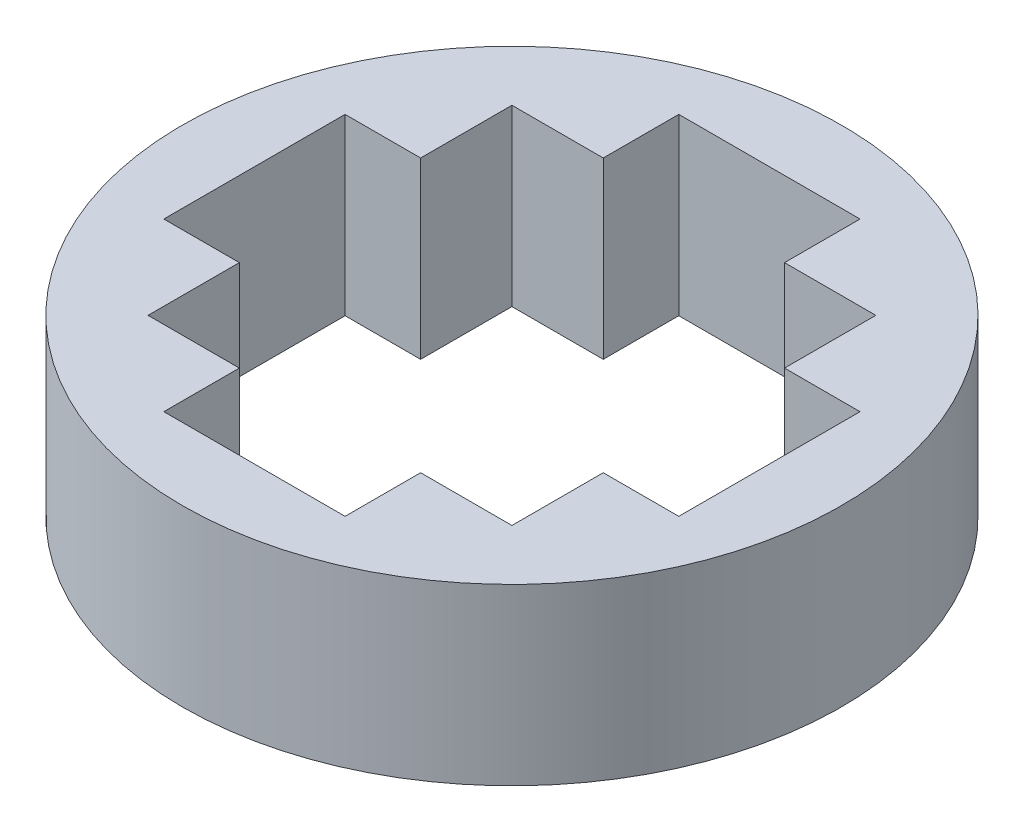
ISO-10303-21;
HEADER;
FILE_DESCRIPTION(('STEP AP214'),'2;1');
FILE_NAME('part.step','',(''),(''),'','','');
FILE_SCHEMA(('AUTOMOTIVE_DESIGN { 1 0 10303 214 1 1 1 1 }'));
ENDSEC;
DATA;
#1=APPLICATION_CONTEXT('core data for automotive mechanical design processes');
#2=APPLICATION_PROTOCOL_DEFINITION('international standard','automotive_design',2000,#1);
#3=PRODUCT_CONTEXT('',#1,'mechanical');
#4=PRODUCT('Part','Part','',(#3));
#5=PRODUCT_RELATED_PRODUCT_CATEGORY('part','',(#4));
#6=PRODUCT_DEFINITION_FORMATION('','',#4);
#7=PRODUCT_DEFINITION_CONTEXT('part definition',#1,'design');
#8=PRODUCT_DEFINITION('design','',#6,#7);
#9=PRODUCT_DEFINITION_SHAPE('','',#8);
#10=(LENGTH_UNIT() NAMED_UNIT(*) SI_UNIT(.MILLI.,.METRE.));
#11=(NAMED_UNIT(*) PLANE_ANGLE_UNIT() SI_UNIT($,.RADIAN.));
#12=(NAMED_UNIT(*) SI_UNIT($,.STERADIAN.) SOLID_ANGLE_UNIT());
#13=UNCERTAINTY_MEASURE_WITH_UNIT(LENGTH_MEASURE(1.E-05),#10,'distance_accuracy_value','');
#14=(GEOMETRIC_REPRESENTATION_CONTEXT(3) GLOBAL_UNCERTAINTY_ASSIGNED_CONTEXT((#13)) GLOBAL_UNIT_ASSIGNED_CONTEXT((#10,
#11,#12)) REPRESENTATION_CONTEXT('',''));
#15=CARTESIAN_POINT('',(0.,0.,0.));
#16=DIRECTION('',(0.,0.,1.));
#17=DIRECTION('',(1.,0.,0.));
#18=AXIS2_PLACEMENT_3D('',#15,#16,#17);
#19=CARTESIAN_POINT('',(0.,6.35,0.));
#20=DIRECTION('',(0.,1.,0.));
#21=DIRECTION('',(0.,0.,1.));
#22=AXIS2_PLACEMENT_3D('',#19,#20,#21);
#23=PLANE('',#22);
#24=CARTESIAN_POINT('',(0.,6.35,0.));
#25=DIRECTION('',(0.,1.,0.));
#26=DIRECTION('',(0.,0.,1.));
#27=AXIS2_PLACEMENT_3D('',#24,#25,#26);
#28=CIRCLE('',#27,24.);
#29=CARTESIAN_POINT('',(0.,6.35,24.));
#30=VERTEX_POINT('',#29);
#31=EDGE_CURVE('E11',#30,#30,#28,.T.);
#32=ORIENTED_EDGE('',*,*,#31,.T.);
#33=EDGE_LOOP('',(#32));
#34=FACE_BOUND('',#33,.T.);
#35=DIRECTION('',(-1.,0.,0.));
#36=VECTOR('',#35,1.);
#37=CARTESIAN_POINT('',(-13.25,6.35,-13.25));
#38=LINE('',#37,#36);
#39=CARTESIAN_POINT('',(-6.6,6.35,-13.25));
#40=VERTEX_POINT('',#39);
#41=CARTESIAN_POINT('',(-13.25,6.35,-13.25));
#42=VERTEX_POINT('',#41);
#43=EDGE_CURVE('E178',#40,#42,#38,.T.);
#44=ORIENTED_EDGE('',*,*,#43,.F.);
#45=DIRECTION('',(0.,0.,1.));
#46=VECTOR('',#45,1.);
#47=CARTESIAN_POINT('',(-6.6,6.35,-13.25));
#48=LINE('',#47,#46);
#49=CARTESIAN_POINT('',(-6.6,6.35,-18.75));
#50=VERTEX_POINT('',#49);
#51=EDGE_CURVE('E170',#50,#40,#48,.T.);
#52=ORIENTED_EDGE('',*,*,#51,.F.);
#53=DIRECTION('',(-1.,0.,0.));
#54=VECTOR('',#53,1.);
#55=CARTESIAN_POINT('',(-6.6,6.35,-18.75));
#56=LINE('',#55,#54);
#57=CARTESIAN_POINT('',(6.6,6.35,-18.75));
#58=VERTEX_POINT('',#57);
#59=EDGE_CURVE('E226',#58,#50,#56,.T.);
#60=ORIENTED_EDGE('',*,*,#59,.F.);
#61=DIRECTION('',(0.,0.,-1.));
#62=VECTOR('',#61,1.);
#63=CARTESIAN_POINT('',(6.6,6.35,-18.75));
#64=LINE('',#63,#62);
#65=CARTESIAN_POINT('',(6.6,6.35,-13.25));
#66=VERTEX_POINT('',#65);
#67=EDGE_CURVE('E224',#66,#58,#64,.T.);
#68=ORIENTED_EDGE('',*,*,#67,.F.);
#69=DIRECTION('',(-1.,0.,0.));
#70=VECTOR('',#69,1.);
#71=CARTESIAN_POINT('',(6.6,6.35,-13.25));
#72=LINE('',#71,#70);
#73=CARTESIAN_POINT('',(13.25,6.35,-13.25));
#74=VERTEX_POINT('',#73);
#75=EDGE_CURVE('E222',#74,#66,#72,.T.);
#76=ORIENTED_EDGE('',*,*,#75,.F.);
#77=DIRECTION('',(0.,0.,-1.));
#78=VECTOR('',#77,1.);
#79=CARTESIAN_POINT('',(13.25,6.35,-13.25));
#80=LINE('',#79,#78);
#81=CARTESIAN_POINT('',(13.25,6.35,-6.6));
#82=VERTEX_POINT('',#81);
#83=EDGE_CURVE('E220',#82,#74,#80,.T.);
#84=ORIENTED_EDGE('',*,*,#83,.F.);
#85=DIRECTION('',(-1.,0.,0.));
#86=VECTOR('',#85,1.);
#87=CARTESIAN_POINT('',(13.25,6.35,-6.6));
#88=LINE('',#87,#86);
#89=CARTESIAN_POINT('',(18.75,6.35,-6.6));
#90=VERTEX_POINT('',#89);
#91=EDGE_CURVE('E218',#90,#82,#88,.T.);
#92=ORIENTED_EDGE('',*,*,#91,.F.);
#93=DIRECTION('',(0.,0.,-1.));
#94=VECTOR('',#93,1.);
#95=CARTESIAN_POINT('',(18.75,6.35,-6.6));
#96=LINE('',#95,#94);
#97=CARTESIAN_POINT('',(18.75,6.35,6.6));
#98=VERTEX_POINT('',#97);
#99=EDGE_CURVE('E216',#98,#90,#96,.T.);
#100=ORIENTED_EDGE('',*,*,#99,.F.);
#101=DIRECTION('',(1.,0.,0.));
#102=VECTOR('',#101,1.);
#103=CARTESIAN_POINT('',(18.75,6.35,6.6));
#104=LINE('',#103,#102);
#105=CARTESIAN_POINT('',(13.25,6.35,6.6));
#106=VERTEX_POINT('',#105);
#107=EDGE_CURVE('E214',#106,#98,#104,.T.);
#108=ORIENTED_EDGE('',*,*,#107,.F.);
#109=DIRECTION('',(0.,0.,-1.));
#110=VECTOR('',#109,1.);
#111=CARTESIAN_POINT('',(13.25,6.35,6.6));
#112=LINE('',#111,#110);
#113=CARTESIAN_POINT('',(13.25,6.35,13.25));
#114=VERTEX_POINT('',#113);
#115=EDGE_CURVE('E212',#114,#106,#112,.T.);
#116=ORIENTED_EDGE('',*,*,#115,.F.);
#117=DIRECTION('',(1.,0.,0.));
#118=VECTOR('',#117,1.);
#119=CARTESIAN_POINT('',(13.25,6.35,13.25));
#120=LINE('',#119,#118);
#121=CARTESIAN_POINT('',(6.6,6.35,13.25));
#122=VERTEX_POINT('',#121);
#123=EDGE_CURVE('E210',#122,#114,#120,.T.);
#124=ORIENTED_EDGE('',*,*,#123,.F.);
#125=DIRECTION('',(0.,0.,-1.));
#126=VECTOR('',#125,1.);
#127=CARTESIAN_POINT('',(6.6,6.35,13.25));
#128=LINE('',#127,#126);
#129=CARTESIAN_POINT('',(6.6,6.35,18.75));
#130=VERTEX_POINT('',#129);
#131=EDGE_CURVE('E208',#130,#122,#128,.T.);
#132=ORIENTED_EDGE('',*,*,#131,.F.);
#133=DIRECTION('',(1.,0.,0.));
#134=VECTOR('',#133,1.);
#135=CARTESIAN_POINT('',(6.6,6.35,18.75));
#136=LINE('',#135,#134);
#137=CARTESIAN_POINT('',(-6.6,6.35,18.75));
#138=VERTEX_POINT('',#137);
#139=EDGE_CURVE('E206',#138,#130,#136,.T.);
#140=ORIENTED_EDGE('',*,*,#139,.F.);
#141=DIRECTION('',(0.,0.,1.));
#142=VECTOR('',#141,1.);
#143=CARTESIAN_POINT('',(-6.6,6.35,18.75));
#144=LINE('',#143,#142);
#145=CARTESIAN_POINT('',(-6.6,6.35,13.25));
#146=VERTEX_POINT('',#145);
#147=EDGE_CURVE('E204',#146,#138,#144,.T.);
#148=ORIENTED_EDGE('',*,*,#147,.F.);
#149=DIRECTION('',(1.,0.,0.));
#150=VECTOR('',#149,1.);
#151=CARTESIAN_POINT('',(-6.6,6.35,13.25));
#152=LINE('',#151,#150);
#153=CARTESIAN_POINT('',(-13.25,6.35,13.25));
#154=VERTEX_POINT('',#153);
#155=EDGE_CURVE('E202',#154,#146,#152,.T.);
#156=ORIENTED_EDGE('',*,*,#155,.F.);
#157=DIRECTION('',(0.,0.,1.));
#158=VECTOR('',#157,1.);
#159=CARTESIAN_POINT('',(-13.25,6.35,13.25));
#160=LINE('',#159,#158);
#161=CARTESIAN_POINT('',(-13.25,6.35,6.6));
#162=VERTEX_POINT('',#161);
#163=EDGE_CURVE('E200',#162,#154,#160,.T.);
#164=ORIENTED_EDGE('',*,*,#163,.F.);
#165=DIRECTION('',(1.,0.,0.));
#166=VECTOR('',#165,1.);
#167=CARTESIAN_POINT('',(-13.25,6.35,6.6));
#168=LINE('',#167,#166);
#169=CARTESIAN_POINT('',(-18.75,6.35,6.6));
#170=VERTEX_POINT('',#169);
#171=EDGE_CURVE('E198',#170,#162,#168,.T.);
#172=ORIENTED_EDGE('',*,*,#171,.F.);
#173=DIRECTION('',(0.,0.,1.));
#174=VECTOR('',#173,1.);
#175=CARTESIAN_POINT('',(-18.75,6.35,6.6));
#176=LINE('',#175,#174);
#177=CARTESIAN_POINT('',(-18.75,6.35,-6.6));
#178=VERTEX_POINT('',#177);
#179=EDGE_CURVE('E196',#178,#170,#176,.T.);
#180=ORIENTED_EDGE('',*,*,#179,.F.);
#181=DIRECTION('',(-1.,0.,0.));
#182=VECTOR('',#181,1.);
#183=CARTESIAN_POINT('',(-18.75,6.35,-6.6));
#184=LINE('',#183,#182);
#185=CARTESIAN_POINT('',(-13.25,6.35,-6.6));
#186=VERTEX_POINT('',#185);
#187=EDGE_CURVE('E192',#186,#178,#184,.T.);
#188=ORIENTED_EDGE('',*,*,#187,.F.);
#189=DIRECTION('',(0.,0.,1.));
#190=VECTOR('',#189,1.);
#191=CARTESIAN_POINT('',(-13.25,6.35,-6.6));
#192=LINE('',#191,#190);
#193=EDGE_CURVE('E190',#42,#186,#192,.T.);
#194=ORIENTED_EDGE('',*,*,#193,.F.);
#195=EDGE_LOOP('',(#44,#52,#60,#68,#76,#84,#92,#100,#108,#116,#124,#132,#140,#148,#156,#164,
#172,#180,#188,#194));
#196=FACE_BOUND('',#195,.T.);
#197=ADVANCED_FACE('F33',(#34,#196),#23,.T.);
#198=CARTESIAN_POINT('',(0.,-6.35,0.));
#199=DIRECTION('',(0.,1.,0.));
#200=DIRECTION('',(0.,0.,1.));
#201=AXIS2_PLACEMENT_3D('',#198,#199,#200);
#202=PLANE('',#201);
#203=CARTESIAN_POINT('',(0.,-6.35,0.));
#204=DIRECTION('',(0.,1.,0.));
#205=DIRECTION('',(0.,0.,1.));
#206=AXIS2_PLACEMENT_3D('',#203,#204,#205);
#207=CIRCLE('',#206,24.);
#208=CARTESIAN_POINT('',(0.,-6.35,24.));
#209=VERTEX_POINT('',#208);
#210=EDGE_CURVE('E37',#209,#209,#207,.T.);
#211=ORIENTED_EDGE('',*,*,#210,.F.);
#212=EDGE_LOOP('',(#211));
#213=FACE_BOUND('',#212,.T.);
#214=DIRECTION('',(0.,0.,1.));
#215=VECTOR('',#214,1.);
#216=CARTESIAN_POINT('',(-6.6,-6.35,-13.25));
#217=LINE('',#216,#215);
#218=CARTESIAN_POINT('',(-6.6,-6.35,-18.75));
#219=VERTEX_POINT('',#218);
#220=CARTESIAN_POINT('',(-6.6,-6.35,-13.25));
#221=VERTEX_POINT('',#220);
#222=EDGE_CURVE('E56',#219,#221,#217,.T.);
#223=ORIENTED_EDGE('',*,*,#222,.T.);
#224=DIRECTION('',(-1.,0.,0.));
#225=VECTOR('',#224,1.);
#226=CARTESIAN_POINT('',(-13.25,-6.35,-13.25));
#227=LINE('',#226,#225);
#228=CARTESIAN_POINT('',(-13.25,-6.35,-13.25));
#229=VERTEX_POINT('',#228);
#230=EDGE_CURVE('E185',#221,#229,#227,.T.);
#231=ORIENTED_EDGE('',*,*,#230,.T.);
#232=DIRECTION('',(0.,0.,1.));
#233=VECTOR('',#232,1.);
#234=CARTESIAN_POINT('',(-13.25,-6.35,-6.6));
#235=LINE('',#234,#233);
#236=CARTESIAN_POINT('',(-13.25,-6.35,-6.6));
#237=VERTEX_POINT('',#236);
#238=EDGE_CURVE('E230',#229,#237,#235,.T.);
#239=ORIENTED_EDGE('',*,*,#238,.T.);
#240=DIRECTION('',(-1.,0.,0.));
#241=VECTOR('',#240,1.);
#242=CARTESIAN_POINT('',(-18.75,-6.35,-6.6));
#243=LINE('',#242,#241);
#244=CARTESIAN_POINT('',(-18.75,-6.35,-6.6));
#245=VERTEX_POINT('',#244);
#246=EDGE_CURVE('E233',#237,#245,#243,.T.);
#247=ORIENTED_EDGE('',*,*,#246,.T.);
#248=DIRECTION('',(0.,0.,1.));
#249=VECTOR('',#248,1.);
#250=CARTESIAN_POINT('',(-18.75,-6.35,6.6));
#251=LINE('',#250,#249);
#252=CARTESIAN_POINT('',(-18.75,-6.35,6.6));
#253=VERTEX_POINT('',#252);
#254=EDGE_CURVE('E236',#245,#253,#251,.T.);
#255=ORIENTED_EDGE('',*,*,#254,.T.);
#256=DIRECTION('',(1.,0.,0.));
#257=VECTOR('',#256,1.);
#258=CARTESIAN_POINT('',(-13.25,-6.35,6.6));
#259=LINE('',#258,#257);
#260=CARTESIAN_POINT('',(-13.25,-6.35,6.6));
#261=VERTEX_POINT('',#260);
#262=EDGE_CURVE('E239',#253,#261,#259,.T.);
#263=ORIENTED_EDGE('',*,*,#262,.T.);
#264=DIRECTION('',(0.,0.,1.));
#265=VECTOR('',#264,1.);
#266=CARTESIAN_POINT('',(-13.25,-6.35,13.25));
#267=LINE('',#266,#265);
#268=CARTESIAN_POINT('',(-13.25,-6.35,13.25));
#269=VERTEX_POINT('',#268);
#270=EDGE_CURVE('E242',#261,#269,#267,.T.);
#271=ORIENTED_EDGE('',*,*,#270,.T.);
#272=DIRECTION('',(1.,0.,0.));
#273=VECTOR('',#272,1.);
#274=CARTESIAN_POINT('',(-6.6,-6.35,13.25));
#275=LINE('',#274,#273);
#276=CARTESIAN_POINT('',(-6.6,-6.35,13.25));
#277=VERTEX_POINT('',#276);
#278=EDGE_CURVE('E245',#269,#277,#275,.T.);
#279=ORIENTED_EDGE('',*,*,#278,.T.);
#280=DIRECTION('',(0.,0.,1.));
#281=VECTOR('',#280,1.);
#282=CARTESIAN_POINT('',(-6.6,-6.35,18.75));
#283=LINE('',#282,#281);
#284=CARTESIAN_POINT('',(-6.6,-6.35,18.75));
#285=VERTEX_POINT('',#284);
#286=EDGE_CURVE('E248',#277,#285,#283,.T.);
#287=ORIENTED_EDGE('',*,*,#286,.T.);
#288=DIRECTION('',(1.,0.,0.));
#289=VECTOR('',#288,1.);
#290=CARTESIAN_POINT('',(6.6,-6.35,18.75));
#291=LINE('',#290,#289);
#292=CARTESIAN_POINT('',(6.6,-6.35,18.75));
#293=VERTEX_POINT('',#292);
#294=EDGE_CURVE('E251',#285,#293,#291,.T.);
#295=ORIENTED_EDGE('',*,*,#294,.T.);
#296=DIRECTION('',(0.,0.,-1.));
#297=VECTOR('',#296,1.);
#298=CARTESIAN_POINT('',(6.6,-6.35,13.25));
#299=LINE('',#298,#297);
#300=CARTESIAN_POINT('',(6.6,-6.35,13.25));
#301=VERTEX_POINT('',#300);
#302=EDGE_CURVE('E254',#293,#301,#299,.T.);
#303=ORIENTED_EDGE('',*,*,#302,.T.);
#304=DIRECTION('',(1.,0.,0.));
#305=VECTOR('',#304,1.);
#306=CARTESIAN_POINT('',(13.25,-6.35,13.25));
#307=LINE('',#306,#305);
#308=CARTESIAN_POINT('',(13.25,-6.35,13.25));
#309=VERTEX_POINT('',#308);
#310=EDGE_CURVE('E257',#301,#309,#307,.T.);
#311=ORIENTED_EDGE('',*,*,#310,.T.);
#312=DIRECTION('',(0.,0.,-1.));
#313=VECTOR('',#312,1.);
#314=CARTESIAN_POINT('',(13.25,-6.35,6.6));
#315=LINE('',#314,#313);
#316=CARTESIAN_POINT('',(13.25,-6.35,6.6));
#317=VERTEX_POINT('',#316);
#318=EDGE_CURVE('E260',#309,#317,#315,.T.);
#319=ORIENTED_EDGE('',*,*,#318,.T.);
#320=DIRECTION('',(1.,0.,0.));
#321=VECTOR('',#320,1.);
#322=CARTESIAN_POINT('',(18.75,-6.35,6.6));
#323=LINE('',#322,#321);
#324=CARTESIAN_POINT('',(18.75,-6.35,6.6));
#325=VERTEX_POINT('',#324);
#326=EDGE_CURVE('E263',#317,#325,#323,.T.);
#327=ORIENTED_EDGE('',*,*,#326,.T.);
#328=DIRECTION('',(0.,0.,-1.));
#329=VECTOR('',#328,1.);
#330=CARTESIAN_POINT('',(18.75,-6.35,-6.6));
#331=LINE('',#330,#329);
#332=CARTESIAN_POINT('',(18.75,-6.35,-6.6));
#333=VERTEX_POINT('',#332);
#334=EDGE_CURVE('E266',#325,#333,#331,.T.);
#335=ORIENTED_EDGE('',*,*,#334,.T.);
#336=DIRECTION('',(-1.,0.,0.));
#337=VECTOR('',#336,1.);
#338=CARTESIAN_POINT('',(13.25,-6.35,-6.6));
#339=LINE('',#338,#337);
#340=CARTESIAN_POINT('',(13.25,-6.35,-6.6));
#341=VERTEX_POINT('',#340);
#342=EDGE_CURVE('E269',#333,#341,#339,.T.);
#343=ORIENTED_EDGE('',*,*,#342,.T.);
#344=DIRECTION('',(0.,0.,-1.));
#345=VECTOR('',#344,1.);
#346=CARTESIAN_POINT('',(13.25,-6.35,-13.25));
#347=LINE('',#346,#345);
#348=CARTESIAN_POINT('',(13.25,-6.35,-13.25));
#349=VERTEX_POINT('',#348);
#350=EDGE_CURVE('E272',#341,#349,#347,.T.);
#351=ORIENTED_EDGE('',*,*,#350,.T.);
#352=DIRECTION('',(-1.,0.,0.));
#353=VECTOR('',#352,1.);
#354=CARTESIAN_POINT('',(6.6,-6.35,-13.25));
#355=LINE('',#354,#353);
#356=CARTESIAN_POINT('',(6.6,-6.35,-13.25));
#357=VERTEX_POINT('',#356);
#358=EDGE_CURVE('E275',#349,#357,#355,.T.);
#359=ORIENTED_EDGE('',*,*,#358,.T.);
#360=DIRECTION('',(0.,0.,-1.));
#361=VECTOR('',#360,1.);
#362=CARTESIAN_POINT('',(6.6,-6.35,-18.75));
#363=LINE('',#362,#361);
#364=CARTESIAN_POINT('',(6.6,-6.35,-18.75));
#365=VERTEX_POINT('',#364);
#366=EDGE_CURVE('E278',#357,#365,#363,.T.);
#367=ORIENTED_EDGE('',*,*,#366,.T.);
#368=DIRECTION('',(-1.,0.,0.));
#369=VECTOR('',#368,1.);
#370=CARTESIAN_POINT('',(-6.6,-6.35,-18.75));
#371=LINE('',#370,#369);
#372=EDGE_CURVE('E179',#365,#219,#371,.T.);
#373=ORIENTED_EDGE('',*,*,#372,.T.);
#374=EDGE_LOOP('',(#223,#231,#239,#247,#255,#263,#271,#279,#287,#295,#303,#311,#319,#327,#335,
#343,#351,#359,#367,#373));
#375=FACE_BOUND('',#374,.T.);
#376=ADVANCED_FACE('F323',(#213,#375),#202,.F.);
#377=CARTESIAN_POINT('',(0.,6.35,0.));
#378=DIRECTION('',(0.,-1.,0.));
#379=DIRECTION('',(0.,0.,-1.));
#380=AXIS2_PLACEMENT_3D('',#377,#378,#379);
#381=CYLINDRICAL_SURFACE('',#380,24.);
#382=ORIENTED_EDGE('',*,*,#31,.F.);
#383=EDGE_LOOP('',(#382));
#384=FACE_BOUND('',#383,.T.);
#385=ORIENTED_EDGE('',*,*,#210,.T.);
#386=EDGE_LOOP('',(#385));
#387=FACE_BOUND('',#386,.T.);
#388=ADVANCED_FACE('F35',(#384,#387),#381,.T.);
#389=CARTESIAN_POINT('',(-6.6,6.35,-13.25));
#390=DIRECTION('',(1.,0.,0.));
#391=DIRECTION('',(0.,0.,-1.));
#392=AXIS2_PLACEMENT_3D('',#389,#390,#391);
#393=PLANE('',#392);
#394=ORIENTED_EDGE('',*,*,#222,.F.);
#395=DIRECTION('',(0.,-1.,0.));
#396=VECTOR('',#395,1.);
#397=CARTESIAN_POINT('',(-6.6,6.35,-18.75));
#398=LINE('',#397,#396);
#399=EDGE_CURVE('E174',#50,#219,#398,.T.);
#400=ORIENTED_EDGE('',*,*,#399,.F.);
#401=ORIENTED_EDGE('',*,*,#51,.T.);
#402=DIRECTION('',(0.,-1.,0.));
#403=VECTOR('',#402,1.);
#404=CARTESIAN_POINT('',(-6.6,6.35,-13.25));
#405=LINE('',#404,#403);
#406=EDGE_CURVE('E173',#40,#221,#405,.T.);
#407=ORIENTED_EDGE('',*,*,#406,.T.);
#408=EDGE_LOOP('',(#394,#400,#401,#407));
#409=FACE_BOUND('',#408,.T.);
#410=ADVANCED_FACE('F172',(#409),#393,.T.);
#411=CARTESIAN_POINT('',(-13.25,6.35,-13.25));
#412=DIRECTION('',(0.,0.,1.));
#413=DIRECTION('',(1.,0.,0.));
#414=AXIS2_PLACEMENT_3D('',#411,#412,#413);
#415=PLANE('',#414);
#416=ORIENTED_EDGE('',*,*,#230,.F.);
#417=ORIENTED_EDGE('',*,*,#406,.F.);
#418=ORIENTED_EDGE('',*,*,#43,.T.);
#419=DIRECTION('',(0.,-1.,0.));
#420=VECTOR('',#419,1.);
#421=CARTESIAN_POINT('',(-13.25,6.35,-13.25));
#422=LINE('',#421,#420);
#423=EDGE_CURVE('E186',#42,#229,#422,.T.);
#424=ORIENTED_EDGE('',*,*,#423,.T.);
#425=EDGE_LOOP('',(#416,#417,#418,#424));
#426=FACE_BOUND('',#425,.T.);
#427=ADVANCED_FACE('F182',(#426),#415,.T.);
#428=CARTESIAN_POINT('',(-13.25,6.35,-6.6));
#429=DIRECTION('',(1.,0.,0.));
#430=DIRECTION('',(0.,0.,-1.));
#431=AXIS2_PLACEMENT_3D('',#428,#429,#430);
#432=PLANE('',#431);
#433=ORIENTED_EDGE('',*,*,#238,.F.);
#434=ORIENTED_EDGE('',*,*,#423,.F.);
#435=ORIENTED_EDGE('',*,*,#193,.T.);
#436=DIRECTION('',(0.,-1.,0.));
#437=VECTOR('',#436,1.);
#438=CARTESIAN_POINT('',(-13.25,6.35,-6.6));
#439=LINE('',#438,#437);
#440=EDGE_CURVE('E315',#186,#237,#439,.T.);
#441=ORIENTED_EDGE('',*,*,#440,.T.);
#442=EDGE_LOOP('',(#433,#434,#435,#441));
#443=FACE_BOUND('',#442,.T.);
#444=ADVANCED_FACE('F319',(#443),#432,.T.);
#445=CARTESIAN_POINT('',(-18.75,6.35,-6.6));
#446=DIRECTION('',(0.,0.,1.));
#447=DIRECTION('',(1.,0.,0.));
#448=AXIS2_PLACEMENT_3D('',#445,#446,#447);
#449=PLANE('',#448);
#450=ORIENTED_EDGE('',*,*,#246,.F.);
#451=ORIENTED_EDGE('',*,*,#440,.F.);
#452=ORIENTED_EDGE('',*,*,#187,.T.);
#453=DIRECTION('',(0.,-1.,0.));
#454=VECTOR('',#453,1.);
#455=CARTESIAN_POINT('',(-18.75,6.35,-6.6));
#456=LINE('',#455,#454);
#457=EDGE_CURVE('E313',#178,#245,#456,.T.);
#458=ORIENTED_EDGE('',*,*,#457,.T.);
#459=EDGE_LOOP('',(#450,#451,#452,#458));
#460=FACE_BOUND('',#459,.T.);
#461=ADVANCED_FACE('F401',(#460),#449,.T.);
#462=CARTESIAN_POINT('',(-18.75,6.35,6.6));
#463=DIRECTION('',(1.,0.,0.));
#464=DIRECTION('',(0.,0.,-1.));
#465=AXIS2_PLACEMENT_3D('',#462,#463,#464);
#466=PLANE('',#465);
#467=ORIENTED_EDGE('',*,*,#254,.F.);
#468=ORIENTED_EDGE('',*,*,#457,.F.);
#469=ORIENTED_EDGE('',*,*,#179,.T.);
#470=DIRECTION('',(0.,-1.,0.));
#471=VECTOR('',#470,1.);
#472=CARTESIAN_POINT('',(-18.75,6.35,6.6));
#473=LINE('',#472,#471);
#474=EDGE_CURVE('E311',#170,#253,#473,.T.);
#475=ORIENTED_EDGE('',*,*,#474,.T.);
#476=EDGE_LOOP('',(#467,#468,#469,#475));
#477=FACE_BOUND('',#476,.T.);
#478=ADVANCED_FACE('F398',(#477),#466,.T.);
#479=CARTESIAN_POINT('',(-13.25,6.35,6.6));
#480=DIRECTION('',(0.,0.,-1.));
#481=DIRECTION('',(-1.,0.,0.));
#482=AXIS2_PLACEMENT_3D('',#479,#480,#481);
#483=PLANE('',#482);
#484=ORIENTED_EDGE('',*,*,#262,.F.);
#485=ORIENTED_EDGE('',*,*,#474,.F.);
#486=ORIENTED_EDGE('',*,*,#171,.T.);
#487=DIRECTION('',(0.,-1.,0.));
#488=VECTOR('',#487,1.);
#489=CARTESIAN_POINT('',(-13.25,6.35,6.6));
#490=LINE('',#489,#488);
#491=EDGE_CURVE('E309',#162,#261,#490,.T.);
#492=ORIENTED_EDGE('',*,*,#491,.T.);
#493=EDGE_LOOP('',(#484,#485,#486,#492));
#494=FACE_BOUND('',#493,.T.);
#495=ADVANCED_FACE('F394',(#494),#483,.T.);
#496=CARTESIAN_POINT('',(-13.25,6.35,13.25));
#497=DIRECTION('',(1.,0.,0.));
#498=DIRECTION('',(0.,0.,-1.));
#499=AXIS2_PLACEMENT_3D('',#496,#497,#498);
#500=PLANE('',#499);
#501=ORIENTED_EDGE('',*,*,#270,.F.);
#502=ORIENTED_EDGE('',*,*,#491,.F.);
#503=ORIENTED_EDGE('',*,*,#163,.T.);
#504=DIRECTION('',(0.,-1.,0.));
#505=VECTOR('',#504,1.);
#506=CARTESIAN_POINT('',(-13.25,6.35,13.25));
#507=LINE('',#506,#505);
#508=EDGE_CURVE('E307',#154,#269,#507,.T.);
#509=ORIENTED_EDGE('',*,*,#508,.T.);
#510=EDGE_LOOP('',(#501,#502,#503,#509));
#511=FACE_BOUND('',#510,.T.);
#512=ADVANCED_FACE('F391',(#511),#500,.T.);
#513=CARTESIAN_POINT('',(-6.6,6.35,13.25));
#514=DIRECTION('',(0.,0.,-1.));
#515=DIRECTION('',(-1.,0.,0.));
#516=AXIS2_PLACEMENT_3D('',#513,#514,#515);
#517=PLANE('',#516);
#518=ORIENTED_EDGE('',*,*,#278,.F.);
#519=ORIENTED_EDGE('',*,*,#508,.F.);
#520=ORIENTED_EDGE('',*,*,#155,.T.);
#521=DIRECTION('',(0.,-1.,0.));
#522=VECTOR('',#521,1.);
#523=CARTESIAN_POINT('',(-6.6,6.35,13.25));
#524=LINE('',#523,#522);
#525=EDGE_CURVE('E305',#146,#277,#524,.T.);
#526=ORIENTED_EDGE('',*,*,#525,.T.);
#527=EDGE_LOOP('',(#518,#519,#520,#526));
#528=FACE_BOUND('',#527,.T.);
#529=ADVANCED_FACE('F383',(#528),#517,.T.);
#530=CARTESIAN_POINT('',(-6.6,6.35,18.75));
#531=DIRECTION('',(1.,0.,0.));
#532=DIRECTION('',(0.,0.,-1.));
#533=AXIS2_PLACEMENT_3D('',#530,#531,#532);
#534=PLANE('',#533);
#535=ORIENTED_EDGE('',*,*,#286,.F.);
#536=ORIENTED_EDGE('',*,*,#525,.F.);
#537=ORIENTED_EDGE('',*,*,#147,.T.);
#538=DIRECTION('',(0.,-1.,0.));
#539=VECTOR('',#538,1.);
#540=CARTESIAN_POINT('',(-6.6,6.35,18.75));
#541=LINE('',#540,#539);
#542=EDGE_CURVE('E303',#138,#285,#541,.T.);
#543=ORIENTED_EDGE('',*,*,#542,.T.);
#544=EDGE_LOOP('',(#535,#536,#537,#543));
#545=FACE_BOUND('',#544,.T.);
#546=ADVANCED_FACE('F379',(#545),#534,.T.);
#547=CARTESIAN_POINT('',(6.6,6.35,18.75));
#548=DIRECTION('',(0.,0.,-1.));
#549=DIRECTION('',(-1.,0.,0.));
#550=AXIS2_PLACEMENT_3D('',#547,#548,#549);
#551=PLANE('',#550);
#552=ORIENTED_EDGE('',*,*,#294,.F.);
#553=ORIENTED_EDGE('',*,*,#542,.F.);
#554=ORIENTED_EDGE('',*,*,#139,.T.);
#555=DIRECTION('',(0.,-1.,0.));
#556=VECTOR('',#555,1.);
#557=CARTESIAN_POINT('',(6.6,6.35,18.75));
#558=LINE('',#557,#556);
#559=EDGE_CURVE('E301',#130,#293,#558,.T.);
#560=ORIENTED_EDGE('',*,*,#559,.T.);
#561=EDGE_LOOP('',(#552,#553,#554,#560));
#562=FACE_BOUND('',#561,.T.);
#563=ADVANCED_FACE('F376',(#562),#551,.T.);
#564=CARTESIAN_POINT('',(6.6,6.35,13.25));
#565=DIRECTION('',(-1.,0.,0.));
#566=DIRECTION('',(0.,0.,1.));
#567=AXIS2_PLACEMENT_3D('',#564,#565,#566);
#568=PLANE('',#567);
#569=ORIENTED_EDGE('',*,*,#302,.F.);
#570=ORIENTED_EDGE('',*,*,#559,.F.);
#571=ORIENTED_EDGE('',*,*,#131,.T.);
#572=DIRECTION('',(0.,-1.,0.));
#573=VECTOR('',#572,1.);
#574=CARTESIAN_POINT('',(6.6,6.35,13.25));
#575=LINE('',#574,#573);
#576=EDGE_CURVE('E299',#122,#301,#575,.T.);
#577=ORIENTED_EDGE('',*,*,#576,.T.);
#578=EDGE_LOOP('',(#569,#570,#571,#577));
#579=FACE_BOUND('',#578,.T.);
#580=ADVANCED_FACE('F368',(#579),#568,.T.);
#581=CARTESIAN_POINT('',(13.25,6.35,13.25));
#582=DIRECTION('',(0.,0.,-1.));
#583=DIRECTION('',(-1.,0.,0.));
#584=AXIS2_PLACEMENT_3D('',#581,#582,#583);
#585=PLANE('',#584);
#586=ORIENTED_EDGE('',*,*,#310,.F.);
#587=ORIENTED_EDGE('',*,*,#576,.F.);
#588=ORIENTED_EDGE('',*,*,#123,.T.);
#589=DIRECTION('',(0.,-1.,0.));
#590=VECTOR('',#589,1.);
#591=CARTESIAN_POINT('',(13.25,6.35,13.25));
#592=LINE('',#591,#590);
#593=EDGE_CURVE('E297',#114,#309,#592,.T.);
#594=ORIENTED_EDGE('',*,*,#593,.T.);
#595=EDGE_LOOP('',(#586,#587,#588,#594));
#596=FACE_BOUND('',#595,.T.);
#597=ADVANCED_FACE('F364',(#596),#585,.T.);
#598=CARTESIAN_POINT('',(13.25,6.35,6.6));
#599=DIRECTION('',(-1.,0.,0.));
#600=DIRECTION('',(0.,0.,1.));
#601=AXIS2_PLACEMENT_3D('',#598,#599,#600);
#602=PLANE('',#601);
#603=ORIENTED_EDGE('',*,*,#318,.F.);
#604=ORIENTED_EDGE('',*,*,#593,.F.);
#605=ORIENTED_EDGE('',*,*,#115,.T.);
#606=DIRECTION('',(0.,-1.,0.));
#607=VECTOR('',#606,1.);
#608=CARTESIAN_POINT('',(13.25,6.35,6.6));
#609=LINE('',#608,#607);
#610=EDGE_CURVE('E295',#106,#317,#609,.T.);
#611=ORIENTED_EDGE('',*,*,#610,.T.);
#612=EDGE_LOOP('',(#603,#604,#605,#611));
#613=FACE_BOUND('',#612,.T.);
#614=ADVANCED_FACE('F361',(#613),#602,.T.);
#615=CARTESIAN_POINT('',(18.75,6.35,6.6));
#616=DIRECTION('',(0.,0.,-1.));
#617=DIRECTION('',(-1.,0.,0.));
#618=AXIS2_PLACEMENT_3D('',#615,#616,#617);
#619=PLANE('',#618);
#620=ORIENTED_EDGE('',*,*,#326,.F.);
#621=ORIENTED_EDGE('',*,*,#610,.F.);
#622=ORIENTED_EDGE('',*,*,#107,.T.);
#623=DIRECTION('',(0.,-1.,0.));
#624=VECTOR('',#623,1.);
#625=CARTESIAN_POINT('',(18.75,6.35,6.6));
#626=LINE('',#625,#624);
#627=EDGE_CURVE('E293',#98,#325,#626,.T.);
#628=ORIENTED_EDGE('',*,*,#627,.T.);
#629=EDGE_LOOP('',(#620,#621,#622,#628));
#630=FACE_BOUND('',#629,.T.);
#631=ADVANCED_FACE('F353',(#630),#619,.T.);
#632=CARTESIAN_POINT('',(18.75,6.35,-6.6));
#633=DIRECTION('',(-1.,0.,0.));
#634=DIRECTION('',(0.,0.,1.));
#635=AXIS2_PLACEMENT_3D('',#632,#633,#634);
#636=PLANE('',#635);
#637=ORIENTED_EDGE('',*,*,#334,.F.);
#638=ORIENTED_EDGE('',*,*,#627,.F.);
#639=ORIENTED_EDGE('',*,*,#99,.T.);
#640=DIRECTION('',(0.,-1.,0.));
#641=VECTOR('',#640,1.);
#642=CARTESIAN_POINT('',(18.75,6.35,-6.6));
#643=LINE('',#642,#641);
#644=EDGE_CURVE('E291',#90,#333,#643,.T.);
#645=ORIENTED_EDGE('',*,*,#644,.T.);
#646=EDGE_LOOP('',(#637,#638,#639,#645));
#647=FACE_BOUND('',#646,.T.);
#648=ADVANCED_FACE('F349',(#647),#636,.T.);
#649=CARTESIAN_POINT('',(13.25,6.35,-6.6));
#650=DIRECTION('',(0.,0.,1.));
#651=DIRECTION('',(1.,0.,0.));
#652=AXIS2_PLACEMENT_3D('',#649,#650,#651);
#653=PLANE('',#652);
#654=ORIENTED_EDGE('',*,*,#342,.F.);
#655=ORIENTED_EDGE('',*,*,#644,.F.);
#656=ORIENTED_EDGE('',*,*,#91,.T.);
#657=DIRECTION('',(0.,-1.,0.));
#658=VECTOR('',#657,1.);
#659=CARTESIAN_POINT('',(13.25,6.35,-6.6));
#660=LINE('',#659,#658);
#661=EDGE_CURVE('E289',#82,#341,#660,.T.);
#662=ORIENTED_EDGE('',*,*,#661,.T.);
#663=EDGE_LOOP('',(#654,#655,#656,#662));
#664=FACE_BOUND('',#663,.T.);
#665=ADVANCED_FACE('F346',(#664),#653,.T.);
#666=CARTESIAN_POINT('',(13.25,6.35,-13.25));
#667=DIRECTION('',(-1.,0.,0.));
#668=DIRECTION('',(0.,0.,1.));
#669=AXIS2_PLACEMENT_3D('',#666,#667,#668);
#670=PLANE('',#669);
#671=ORIENTED_EDGE('',*,*,#350,.F.);
#672=ORIENTED_EDGE('',*,*,#661,.F.);
#673=ORIENTED_EDGE('',*,*,#83,.T.);
#674=DIRECTION('',(0.,-1.,0.));
#675=VECTOR('',#674,1.);
#676=CARTESIAN_POINT('',(13.25,6.35,-13.25));
#677=LINE('',#676,#675);
#678=EDGE_CURVE('E287',#74,#349,#677,.T.);
#679=ORIENTED_EDGE('',*,*,#678,.T.);
#680=EDGE_LOOP('',(#671,#672,#673,#679));
#681=FACE_BOUND('',#680,.T.);
#682=ADVANCED_FACE('F338',(#681),#670,.T.);
#683=CARTESIAN_POINT('',(6.6,6.35,-13.25));
#684=DIRECTION('',(0.,0.,1.));
#685=DIRECTION('',(1.,0.,0.));
#686=AXIS2_PLACEMENT_3D('',#683,#684,#685);
#687=PLANE('',#686);
#688=ORIENTED_EDGE('',*,*,#358,.F.);
#689=ORIENTED_EDGE('',*,*,#678,.F.);
#690=ORIENTED_EDGE('',*,*,#75,.T.);
#691=DIRECTION('',(0.,-1.,0.));
#692=VECTOR('',#691,1.);
#693=CARTESIAN_POINT('',(6.6,6.35,-13.25));
#694=LINE('',#693,#692);
#695=EDGE_CURVE('E285',#66,#357,#694,.T.);
#696=ORIENTED_EDGE('',*,*,#695,.T.);
#697=EDGE_LOOP('',(#688,#689,#690,#696));
#698=FACE_BOUND('',#697,.T.);
#699=ADVANCED_FACE('F334',(#698),#687,.T.);
#700=CARTESIAN_POINT('',(6.6,6.35,-18.75));
#701=DIRECTION('',(-1.,0.,0.));
#702=DIRECTION('',(0.,0.,1.));
#703=AXIS2_PLACEMENT_3D('',#700,#701,#702);
#704=PLANE('',#703);
#705=ORIENTED_EDGE('',*,*,#366,.F.);
#706=ORIENTED_EDGE('',*,*,#695,.F.);
#707=ORIENTED_EDGE('',*,*,#67,.T.);
#708=DIRECTION('',(0.,-1.,0.));
#709=VECTOR('',#708,1.);
#710=CARTESIAN_POINT('',(6.6,6.35,-18.75));
#711=LINE('',#710,#709);
#712=EDGE_CURVE('E48',#58,#365,#711,.T.);
#713=ORIENTED_EDGE('',*,*,#712,.T.);
#714=EDGE_LOOP('',(#705,#706,#707,#713));
#715=FACE_BOUND('',#714,.T.);
#716=ADVANCED_FACE('F331',(#715),#704,.T.);
#717=CARTESIAN_POINT('',(-6.6,6.35,-18.75));
#718=DIRECTION('',(0.,0.,1.));
#719=DIRECTION('',(1.,0.,0.));
#720=AXIS2_PLACEMENT_3D('',#717,#718,#719);
#721=PLANE('',#720);
#722=ORIENTED_EDGE('',*,*,#372,.F.);
#723=ORIENTED_EDGE('',*,*,#712,.F.);
#724=ORIENTED_EDGE('',*,*,#59,.T.);
#725=ORIENTED_EDGE('',*,*,#399,.T.);
#726=EDGE_LOOP('',(#722,#723,#724,#725));
#727=FACE_BOUND('',#726,.T.);
#728=ADVANCED_FACE('F325',(#727),#721,.T.);
#729=CLOSED_SHELL('',(#197,#376,#388,#410,#427,#444,#461,#478,#495,#512,#529,#546,#563,#580,
#597,#614,#631,#648,#665,#682,#699,#716,#728));
#730=MANIFOLD_SOLID_BREP('B2',#729);
#731=ADVANCED_BREP_SHAPE_REPRESENTATION('',(#18,#730),#14);
#732=SHAPE_DEFINITION_REPRESENTATION(#9,#731);
ENDSEC;
END-ISO-10303-21;
